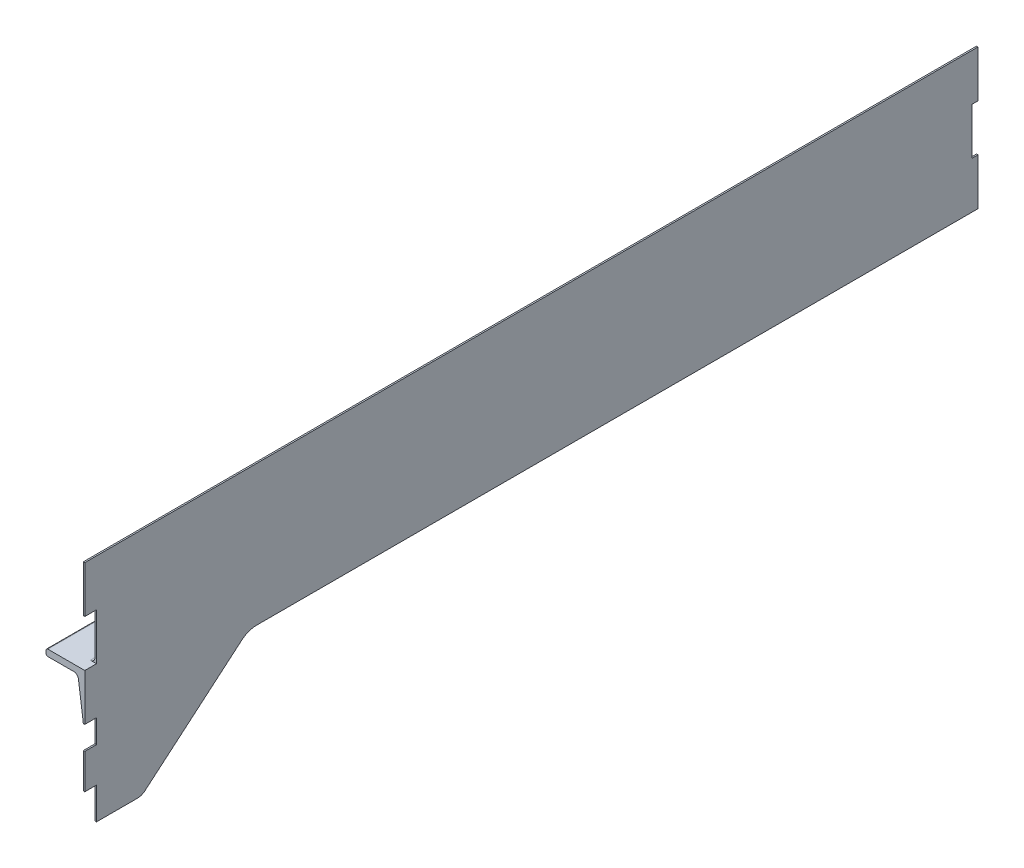
ISO-10303-21;
HEADER;
FILE_DESCRIPTION(('STEP AP214'),'2;1');
FILE_NAME('part.step','',(''),(''),'','','');
FILE_SCHEMA(('AUTOMOTIVE_DESIGN { 1 0 10303 214 1 1 1 1 }'));
ENDSEC;
DATA;
#1=APPLICATION_CONTEXT('core data for automotive mechanical design processes');
#2=APPLICATION_PROTOCOL_DEFINITION('international standard','automotive_design',2000,#1);
#3=PRODUCT_CONTEXT('',#1,'mechanical');
#4=PRODUCT('Part','Part','',(#3));
#5=PRODUCT_RELATED_PRODUCT_CATEGORY('part','',(#4));
#6=PRODUCT_DEFINITION_FORMATION('','',#4);
#7=PRODUCT_DEFINITION_CONTEXT('part definition',#1,'design');
#8=PRODUCT_DEFINITION('design','',#6,#7);
#9=PRODUCT_DEFINITION_SHAPE('','',#8);
#10=(LENGTH_UNIT() NAMED_UNIT(*) SI_UNIT(.MILLI.,.METRE.));
#11=(NAMED_UNIT(*) PLANE_ANGLE_UNIT() SI_UNIT($,.RADIAN.));
#12=(NAMED_UNIT(*) SI_UNIT($,.STERADIAN.) SOLID_ANGLE_UNIT());
#13=UNCERTAINTY_MEASURE_WITH_UNIT(LENGTH_MEASURE(1.E-05),#10,'distance_accuracy_value','');
#14=(GEOMETRIC_REPRESENTATION_CONTEXT(3) GLOBAL_UNCERTAINTY_ASSIGNED_CONTEXT((#13)) GLOBAL_UNIT_ASSIGNED_CONTEXT((#10,
#11,#12)) REPRESENTATION_CONTEXT('',''));
#15=CARTESIAN_POINT('',(0.,0.,0.));
#16=DIRECTION('',(0.,0.,1.));
#17=DIRECTION('',(1.,0.,0.));
#18=AXIS2_PLACEMENT_3D('',#15,#16,#17);
#19=CARTESIAN_POINT('',(-94.488,0.,0.));
#20=DIRECTION('',(-1.,0.,0.));
#21=DIRECTION('',(0.,0.,1.));
#22=AXIS2_PLACEMENT_3D('',#19,#20,#21);
#23=PLANE('',#22);
#24=DIRECTION('',(0.,-1.,0.));
#25=VECTOR('',#24,1.);
#26=CARTESIAN_POINT('',(-94.488,0.,-679.45));
#27=LINE('',#26,#25);
#28=CARTESIAN_POINT('',(-94.488,-85.7250000000001,-679.45));
#29=VERTEX_POINT('',#28);
#30=CARTESIAN_POINT('',(-94.488,-108.585,-679.45));
#31=VERTEX_POINT('',#30);
#32=EDGE_CURVE('E49',#29,#31,#27,.T.);
#33=ORIENTED_EDGE('',*,*,#32,.T.);
#34=DIRECTION('',(0.,0.,-1.));
#35=VECTOR('',#34,1.);
#36=CARTESIAN_POINT('',(-94.488,-108.585,-196.85));
#37=LINE('',#36,#35);
#38=CARTESIAN_POINT('',(-94.488,-108.585,-203.2));
#39=VERTEX_POINT('',#38);
#40=EDGE_CURVE('E11',#31,#39,#37,.F.);
#41=ORIENTED_EDGE('',*,*,#40,.T.);
#42=DIRECTION('',(0.,1.,0.));
#43=VECTOR('',#42,1.);
#44=CARTESIAN_POINT('',(-94.488,0.,-203.2));
#45=LINE('',#44,#43);
#46=CARTESIAN_POINT('',(-94.488,-85.7250000000001,-203.2));
#47=VERTEX_POINT('',#46);
#48=EDGE_CURVE('E226',#39,#47,#45,.T.);
#49=ORIENTED_EDGE('',*,*,#48,.T.);
#50=DIRECTION('',(0.,0.,1.));
#51=VECTOR('',#50,1.);
#52=CARTESIAN_POINT('',(-94.488,-85.7249999999983,7.4940054162198E-13));
#53=LINE('',#52,#51);
#54=CARTESIAN_POINT('',(-94.488,-85.7250000000001,-196.85));
#55=VERTEX_POINT('',#54);
#56=EDGE_CURVE('E228',#47,#55,#53,.T.);
#57=ORIENTED_EDGE('',*,*,#56,.T.);
#58=DIRECTION('',(0.,1.,0.));
#59=VECTOR('',#58,1.);
#60=CARTESIAN_POINT('',(-94.488,8.60422844084493E-13,-196.85));
#61=LINE('',#60,#59);
#62=CARTESIAN_POINT('',(-94.488,-60.325,-196.85));
#63=VERTEX_POINT('',#62);
#64=EDGE_CURVE('E232',#55,#63,#61,.T.);
#65=ORIENTED_EDGE('',*,*,#64,.T.);
#66=DIRECTION('',(0.,0.,-1.));
#67=VECTOR('',#66,1.);
#68=CARTESIAN_POINT('',(-94.488,-60.325,0.));
#69=LINE('',#68,#67);
#70=CARTESIAN_POINT('',(-94.488,-60.3250000000001,-682.625));
#71=VERTEX_POINT('',#70);
#72=EDGE_CURVE('E235',#63,#71,#69,.T.);
#73=ORIENTED_EDGE('',*,*,#72,.T.);
#74=DIRECTION('',(0.,-1.,0.));
#75=VECTOR('',#74,1.);
#76=CARTESIAN_POINT('',(-94.488,0.,-682.625));
#77=LINE('',#76,#75);
#78=CARTESIAN_POINT('',(-94.488,-85.7250000000001,-682.625));
#79=VERTEX_POINT('',#78);
#80=EDGE_CURVE('E238',#71,#79,#77,.T.);
#81=ORIENTED_EDGE('',*,*,#80,.T.);
#82=DIRECTION('',(0.,0.,1.));
#83=VECTOR('',#82,1.);
#84=CARTESIAN_POINT('',(-94.488,-85.7250000000001,0.));
#85=LINE('',#84,#83);
#86=EDGE_CURVE('E241',#79,#29,#85,.T.);
#87=ORIENTED_EDGE('',*,*,#86,.T.);
#88=EDGE_LOOP('',(#33,#41,#49,#57,#65,#73,#81,#87));
#89=FACE_BOUND('',#88,.T.);
#90=ADVANCED_FACE('F35',(#89),#23,.T.);
#91=DIRECTION('',(0.,0.,1.));
#92=VECTOR('',#91,1.);
#93=CARTESIAN_POINT('',(-94.488,-136.525,0.));
#94=LINE('',#93,#92);
#95=CARTESIAN_POINT('',(-94.488,-136.525,-290.406498706893));
#96=VERTEX_POINT('',#95);
#97=CARTESIAN_POINT('',(-94.488,-136.525,-203.2));
#98=VERTEX_POINT('',#97);
#99=EDGE_CURVE('E43',#96,#98,#94,.T.);
#100=ORIENTED_EDGE('',*,*,#99,.F.);
#101=CARTESIAN_POINT('',(-94.488,-149.225,-290.406498706893));
#102=DIRECTION('',(-1.,0.,0.));
#103=DIRECTION('',(0.,0.,1.));
#104=AXIS2_PLACEMENT_3D('',#101,#102,#103);
#105=CIRCLE('',#104,12.7);
#106=CARTESIAN_POINT('',(-94.488,-139.534994681408,-282.197126201904));
#107=VERTEX_POINT('',#106);
#108=EDGE_CURVE('E254',#107,#96,#105,.T.);
#109=ORIENTED_EDGE('',*,*,#108,.F.);
#110=DIRECTION('',(0.,0.646407283857374,-0.762992544771004));
#111=VECTOR('',#110,1.);
#112=CARTESIAN_POINT('',(-94.488,-220.4120949489,-186.73312681973));
#113=LINE('',#112,#111);
#114=CARTESIAN_POINT('',(-94.488,-184.118202659296,-229.572943030403));
#115=VERTEX_POINT('',#114);
#116=EDGE_CURVE('E258',#115,#107,#113,.T.);
#117=ORIENTED_EDGE('',*,*,#116,.F.);
#118=CARTESIAN_POINT('',(-94.488,-179.2732,-225.468256777908));
#119=DIRECTION('',(-1.,0.,0.));
#120=DIRECTION('',(0.,0.,1.));
#121=AXIS2_PLACEMENT_3D('',#118,#119,#120);
#122=CIRCLE('',#121,6.35);
#123=CARTESIAN_POINT('',(-94.488,-185.6232,-225.468256777908));
#124=VERTEX_POINT('',#123);
#125=EDGE_CURVE('E260',#115,#124,#122,.T.);
#126=ORIENTED_EDGE('',*,*,#125,.T.);
#127=DIRECTION('',(0.,0.,-1.));
#128=VECTOR('',#127,1.);
#129=CARTESIAN_POINT('',(-94.488,-185.6232,0.));
#130=LINE('',#129,#128);
#131=CARTESIAN_POINT('',(-94.488,-185.6232,-203.2));
#132=VERTEX_POINT('',#131);
#133=EDGE_CURVE('E263',#132,#124,#130,.T.);
#134=ORIENTED_EDGE('',*,*,#133,.F.);
#135=DIRECTION('',(0.,-1.,0.));
#136=VECTOR('',#135,1.);
#137=CARTESIAN_POINT('',(-94.488,0.,-203.2));
#138=LINE('',#137,#136);
#139=CARTESIAN_POINT('',(-94.488,-168.275,-203.2));
#140=VERTEX_POINT('',#139);
#141=EDGE_CURVE('E266',#140,#132,#138,.T.);
#142=ORIENTED_EDGE('',*,*,#141,.F.);
#143=DIRECTION('',(0.,0.,-1.));
#144=VECTOR('',#143,1.);
#145=CARTESIAN_POINT('',(-94.488,-168.275,0.));
#146=LINE('',#145,#144);
#147=CARTESIAN_POINT('',(-94.488,-168.275,-196.85));
#148=VERTEX_POINT('',#147);
#149=EDGE_CURVE('E268',#148,#140,#146,.T.);
#150=ORIENTED_EDGE('',*,*,#149,.F.);
#151=DIRECTION('',(0.,1.,0.));
#152=VECTOR('',#151,1.);
#153=CARTESIAN_POINT('',(-94.488,0.,-196.85));
#154=LINE('',#153,#152);
#155=CARTESIAN_POINT('',(-94.488,-149.225,-196.85));
#156=VERTEX_POINT('',#155);
#157=EDGE_CURVE('E270',#148,#156,#154,.T.);
#158=ORIENTED_EDGE('',*,*,#157,.T.);
#159=DIRECTION('',(0.,0.,1.));
#160=VECTOR('',#159,1.);
#161=CARTESIAN_POINT('',(-94.488,-149.225,0.));
#162=LINE('',#161,#160);
#163=CARTESIAN_POINT('',(-94.488,-149.225,-203.2));
#164=VERTEX_POINT('',#163);
#165=EDGE_CURVE('E273',#164,#156,#162,.T.);
#166=ORIENTED_EDGE('',*,*,#165,.F.);
#167=DIRECTION('',(0.,-1.,0.));
#168=VECTOR('',#167,1.);
#169=CARTESIAN_POINT('',(-94.488,0.,-203.2));
#170=LINE('',#169,#168);
#171=EDGE_CURVE('E211',#98,#164,#170,.T.);
#172=ORIENTED_EDGE('',*,*,#171,.F.);
#173=EDGE_LOOP('',(#100,#109,#117,#126,#134,#142,#150,#158,#166,#172));
#174=FACE_BOUND('',#173,.T.);
#175=ADVANCED_FACE('F332',(#174),#23,.T.);
#176=CARTESIAN_POINT('',(-93.69425,-8.60422844084499E-13,-196.85));
#177=DIRECTION('',(0.,0.,1.));
#178=DIRECTION('',(0.,-1.,0.));
#179=AXIS2_PLACEMENT_3D('',#176,#177,#178);
#180=PLANE('',#179);
#181=DIRECTION('',(-1.,0.,0.));
#182=VECTOR('',#181,1.);
#183=CARTESIAN_POINT('',(-93.69425,-111.125,-196.85));
#184=LINE('',#183,#182);
#185=CARTESIAN_POINT('',(-93.69425,-111.125,-196.85));
#186=VERTEX_POINT('',#185);
#187=CARTESIAN_POINT('',(-113.793536469165,-111.125,-196.85));
#188=VERTEX_POINT('',#187);
#189=EDGE_CURVE('E135',#186,#188,#184,.T.);
#190=ORIENTED_EDGE('',*,*,#189,.T.);
#191=CARTESIAN_POINT('',(-113.793536469165,-112.125,-196.85));
#192=DIRECTION('',(0.,0.,-1.));
#193=DIRECTION('',(1.,0.,0.));
#194=AXIS2_PLACEMENT_3D('',#191,#192,#193);
#195=CIRCLE('',#194,1.);
#196=CARTESIAN_POINT('',(-114.793536469165,-112.125,-196.85));
#197=VERTEX_POINT('',#196);
#198=EDGE_CURVE('E418',#197,#188,#195,.T.);
#199=ORIENTED_EDGE('',*,*,#198,.F.);
#200=DIRECTION('',(0.,1.,0.));
#201=VECTOR('',#200,1.);
#202=CARTESIAN_POINT('',(-114.793536469165,-112.125,-196.85));
#203=LINE('',#202,#201);
#204=CARTESIAN_POINT('',(-114.793536469165,-113.625,-196.85));
#205=VERTEX_POINT('',#204);
#206=EDGE_CURVE('E463',#205,#197,#203,.T.);
#207=ORIENTED_EDGE('',*,*,#206,.F.);
#208=CARTESIAN_POINT('',(-113.793536469165,-113.625,-196.85));
#209=DIRECTION('',(0.,0.,-1.));
#210=DIRECTION('',(-1.,0.,0.));
#211=AXIS2_PLACEMENT_3D('',#208,#209,#210);
#212=CIRCLE('',#211,1.);
#213=CARTESIAN_POINT('',(-113.793536469165,-114.625,-196.85));
#214=VERTEX_POINT('',#213);
#215=EDGE_CURVE('E466',#214,#205,#212,.T.);
#216=ORIENTED_EDGE('',*,*,#215,.F.);
#217=DIRECTION('',(-1.,0.,0.));
#218=VECTOR('',#217,1.);
#219=CARTESIAN_POINT('',(-99.6829596012726,-114.625,-196.85));
#220=LINE('',#219,#218);
#221=CARTESIAN_POINT('',(-99.6829596012726,-114.625,-196.85));
#222=VERTEX_POINT('',#221);
#223=EDGE_CURVE('E469',#222,#214,#220,.T.);
#224=ORIENTED_EDGE('',*,*,#223,.F.);
#225=CARTESIAN_POINT('',(-99.6829596012726,-117.165,-196.85));
#226=DIRECTION('',(0.,0.,1.));
#227=DIRECTION('',(1.,0.,0.));
#228=AXIS2_PLACEMENT_3D('',#225,#226,#227);
#229=CIRCLE('',#228,2.54000000000001);
#230=CARTESIAN_POINT('',(-97.1661050318732,-116.822884410625,-196.85));
#231=VERTEX_POINT('',#230);
#232=EDGE_CURVE('E472',#231,#222,#229,.T.);
#233=ORIENTED_EDGE('',*,*,#232,.F.);
#234=DIRECTION('',(-0.134691176919452,0.99088762574777,0.));
#235=VECTOR('',#234,1.);
#236=CARTESIAN_POINT('',(-97.1661050318732,-116.822884410625,-196.85));
#237=LINE('',#236,#235);
#238=CARTESIAN_POINT('',(-94.488,-136.525,-196.85));
#239=VERTEX_POINT('',#238);
#240=EDGE_CURVE('E438',#239,#231,#237,.T.);
#241=ORIENTED_EDGE('',*,*,#240,.F.);
#242=DIRECTION('',(-1.,0.,0.));
#243=VECTOR('',#242,1.);
#244=CARTESIAN_POINT('',(-93.69425,-136.525,-196.85));
#245=LINE('',#244,#243);
#246=CARTESIAN_POINT('',(-93.69425,-136.525,-196.85));
#247=VERTEX_POINT('',#246);
#248=EDGE_CURVE('E58',#247,#239,#245,.T.);
#249=ORIENTED_EDGE('',*,*,#248,.F.);
#250=DIRECTION('',(0.,1.,0.));
#251=VECTOR('',#250,1.);
#252=CARTESIAN_POINT('',(-93.69425,-8.60422844084499E-13,-196.85));
#253=LINE('',#252,#251);
#254=EDGE_CURVE('E412',#247,#186,#253,.T.);
#255=ORIENTED_EDGE('',*,*,#254,.T.);
#256=EDGE_LOOP('',(#190,#199,#207,#216,#224,#233,#241,#249,#255));
#257=FACE_BOUND('',#256,.T.);
#258=ADVANCED_FACE('F37',(#257),#180,.T.);
#259=CARTESIAN_POINT('',(-93.69425,-136.525,0.));
#260=DIRECTION('',(0.,-1.,0.));
#261=DIRECTION('',(0.,0.,-1.));
#262=AXIS2_PLACEMENT_3D('',#259,#260,#261);
#263=PLANE('',#262);
#264=DIRECTION('',(0.,0.,1.));
#265=VECTOR('',#264,1.);
#266=CARTESIAN_POINT('',(-94.488,-136.525,0.));
#267=LINE('',#266,#265);
#268=EDGE_CURVE('E255',#98,#239,#267,.T.);
#269=ORIENTED_EDGE('',*,*,#268,.F.);
#270=DIRECTION('',(-1.,0.,0.));
#271=VECTOR('',#270,1.);
#272=CARTESIAN_POINT('',(-93.69425,-136.525,-203.2));
#273=LINE('',#272,#271);
#274=CARTESIAN_POINT('',(-93.69425,-136.525,-203.2));
#275=VERTEX_POINT('',#274);
#276=EDGE_CURVE('E215',#275,#98,#273,.T.);
#277=ORIENTED_EDGE('',*,*,#276,.F.);
#278=DIRECTION('',(0.,0.,1.));
#279=VECTOR('',#278,1.);
#280=CARTESIAN_POINT('',(-93.69425,-136.525,0.));
#281=LINE('',#280,#279);
#282=EDGE_CURVE('E204',#275,#247,#281,.T.);
#283=ORIENTED_EDGE('',*,*,#282,.T.);
#284=ORIENTED_EDGE('',*,*,#248,.T.);
#285=EDGE_LOOP('',(#269,#277,#283,#284));
#286=FACE_BOUND('',#285,.T.);
#287=ADVANCED_FACE('F625',(#286),#263,.T.);
#288=CARTESIAN_POINT('',(-93.69425,0.,-203.2));
#289=DIRECTION('',(0.,0.,-1.));
#290=DIRECTION('',(-1.,0.,0.));
#291=AXIS2_PLACEMENT_3D('',#288,#289,#290);
#292=PLANE('',#291);
#293=ORIENTED_EDGE('',*,*,#171,.T.);
#294=DIRECTION('',(-1.,0.,0.));
#295=VECTOR('',#294,1.);
#296=CARTESIAN_POINT('',(-93.69425,-149.225,-203.2));
#297=LINE('',#296,#295);
#298=CARTESIAN_POINT('',(-93.69425,-149.225,-203.2));
#299=VERTEX_POINT('',#298);
#300=EDGE_CURVE('E208',#299,#164,#297,.T.);
#301=ORIENTED_EDGE('',*,*,#300,.F.);
#302=DIRECTION('',(0.,-1.,0.));
#303=VECTOR('',#302,1.);
#304=CARTESIAN_POINT('',(-93.69425,0.,-203.2));
#305=LINE('',#304,#303);
#306=EDGE_CURVE('E197',#275,#299,#305,.T.);
#307=ORIENTED_EDGE('',*,*,#306,.F.);
#308=ORIENTED_EDGE('',*,*,#276,.T.);
#309=EDGE_LOOP('',(#293,#301,#307,#308));
#310=FACE_BOUND('',#309,.T.);
#311=ADVANCED_FACE('F209',(#310),#292,.F.);
#312=CARTESIAN_POINT('',(-93.69425,-149.225,0.));
#313=DIRECTION('',(0.,-1.,0.));
#314=DIRECTION('',(0.,0.,-1.));
#315=AXIS2_PLACEMENT_3D('',#312,#313,#314);
#316=PLANE('',#315);
#317=ORIENTED_EDGE('',*,*,#165,.T.);
#318=DIRECTION('',(-1.,0.,0.));
#319=VECTOR('',#318,1.);
#320=CARTESIAN_POINT('',(-93.69425,-149.225,-196.85));
#321=LINE('',#320,#319);
#322=CARTESIAN_POINT('',(-93.69425,-149.225,-196.85));
#323=VERTEX_POINT('',#322);
#324=EDGE_CURVE('E216',#323,#156,#321,.T.);
#325=ORIENTED_EDGE('',*,*,#324,.F.);
#326=DIRECTION('',(0.,0.,1.));
#327=VECTOR('',#326,1.);
#328=CARTESIAN_POINT('',(-93.69425,-149.225,0.));
#329=LINE('',#328,#327);
#330=EDGE_CURVE('E202',#299,#323,#329,.T.);
#331=ORIENTED_EDGE('',*,*,#330,.F.);
#332=ORIENTED_EDGE('',*,*,#300,.T.);
#333=EDGE_LOOP('',(#317,#325,#331,#332));
#334=FACE_BOUND('',#333,.T.);
#335=ADVANCED_FACE('F218',(#334),#316,.F.);
#336=CARTESIAN_POINT('',(-93.69425,0.,-196.85));
#337=DIRECTION('',(0.,0.,1.));
#338=DIRECTION('',(1.,0.,0.));
#339=AXIS2_PLACEMENT_3D('',#336,#337,#338);
#340=PLANE('',#339);
#341=ORIENTED_EDGE('',*,*,#157,.F.);
#342=DIRECTION('',(-1.,0.,0.));
#343=VECTOR('',#342,1.);
#344=CARTESIAN_POINT('',(-93.69425,-168.275,-196.85));
#345=LINE('',#344,#343);
#346=CARTESIAN_POINT('',(-93.69425,-168.275,-196.85));
#347=VERTEX_POINT('',#346);
#348=EDGE_CURVE('E280',#347,#148,#345,.T.);
#349=ORIENTED_EDGE('',*,*,#348,.F.);
#350=DIRECTION('',(0.,1.,0.));
#351=VECTOR('',#350,1.);
#352=CARTESIAN_POINT('',(-93.69425,0.,-196.85));
#353=LINE('',#352,#351);
#354=EDGE_CURVE('E220',#347,#323,#353,.T.);
#355=ORIENTED_EDGE('',*,*,#354,.T.);
#356=ORIENTED_EDGE('',*,*,#324,.T.);
#357=EDGE_LOOP('',(#341,#349,#355,#356));
#358=FACE_BOUND('',#357,.T.);
#359=ADVANCED_FACE('F375',(#358),#340,.T.);
#360=CARTESIAN_POINT('',(-93.69425,-168.275,0.));
#361=DIRECTION('',(0.,1.,0.));
#362=DIRECTION('',(0.,0.,1.));
#363=AXIS2_PLACEMENT_3D('',#360,#361,#362);
#364=PLANE('',#363);
#365=ORIENTED_EDGE('',*,*,#149,.T.);
#366=DIRECTION('',(-1.,0.,0.));
#367=VECTOR('',#366,1.);
#368=CARTESIAN_POINT('',(-93.69425,-168.275,-203.2));
#369=LINE('',#368,#367);
#370=CARTESIAN_POINT('',(-93.69425,-168.275,-203.2));
#371=VERTEX_POINT('',#370);
#372=EDGE_CURVE('E282',#371,#140,#369,.T.);
#373=ORIENTED_EDGE('',*,*,#372,.F.);
#374=DIRECTION('',(0.,0.,-1.));
#375=VECTOR('',#374,1.);
#376=CARTESIAN_POINT('',(-93.69425,-168.275,0.));
#377=LINE('',#376,#375);
#378=EDGE_CURVE('E222',#347,#371,#377,.T.);
#379=ORIENTED_EDGE('',*,*,#378,.F.);
#380=ORIENTED_EDGE('',*,*,#348,.T.);
#381=EDGE_LOOP('',(#365,#373,#379,#380));
#382=FACE_BOUND('',#381,.T.);
#383=ADVANCED_FACE('F373',(#382),#364,.F.);
#384=CARTESIAN_POINT('',(-93.69425,0.,-203.2));
#385=DIRECTION('',(0.,0.,-1.));
#386=DIRECTION('',(-1.,0.,0.));
#387=AXIS2_PLACEMENT_3D('',#384,#385,#386);
#388=PLANE('',#387);
#389=ORIENTED_EDGE('',*,*,#141,.T.);
#390=DIRECTION('',(-1.,0.,0.));
#391=VECTOR('',#390,1.);
#392=CARTESIAN_POINT('',(-93.69425,-185.6232,-203.2));
#393=LINE('',#392,#391);
#394=CARTESIAN_POINT('',(-93.69425,-185.6232,-203.2));
#395=VERTEX_POINT('',#394);
#396=EDGE_CURVE('E285',#395,#132,#393,.T.);
#397=ORIENTED_EDGE('',*,*,#396,.F.);
#398=DIRECTION('',(0.,-1.,0.));
#399=VECTOR('',#398,1.);
#400=CARTESIAN_POINT('',(-93.69425,0.,-203.2));
#401=LINE('',#400,#399);
#402=EDGE_CURVE('E370',#371,#395,#401,.T.);
#403=ORIENTED_EDGE('',*,*,#402,.F.);
#404=ORIENTED_EDGE('',*,*,#372,.T.);
#405=EDGE_LOOP('',(#389,#397,#403,#404));
#406=FACE_BOUND('',#405,.T.);
#407=ADVANCED_FACE('F367',(#406),#388,.F.);
#408=CARTESIAN_POINT('',(-93.69425,-185.6232,0.));
#409=DIRECTION('',(0.,1.,0.));
#410=DIRECTION('',(0.,0.,1.));
#411=AXIS2_PLACEMENT_3D('',#408,#409,#410);
#412=PLANE('',#411);
#413=ORIENTED_EDGE('',*,*,#133,.T.);
#414=DIRECTION('',(-1.,0.,0.));
#415=VECTOR('',#414,1.);
#416=CARTESIAN_POINT('',(-93.69425,-185.6232,-225.468256777908));
#417=LINE('',#416,#415);
#418=CARTESIAN_POINT('',(-93.69425,-185.6232,-225.468256777908));
#419=VERTEX_POINT('',#418);
#420=EDGE_CURVE('E288',#419,#124,#417,.T.);
#421=ORIENTED_EDGE('',*,*,#420,.F.);
#422=DIRECTION('',(0.,0.,-1.));
#423=VECTOR('',#422,1.);
#424=CARTESIAN_POINT('',(-93.69425,-185.6232,0.));
#425=LINE('',#424,#423);
#426=EDGE_CURVE('E376',#395,#419,#425,.T.);
#427=ORIENTED_EDGE('',*,*,#426,.F.);
#428=ORIENTED_EDGE('',*,*,#396,.T.);
#429=EDGE_LOOP('',(#413,#421,#427,#428));
#430=FACE_BOUND('',#429,.T.);
#431=ADVANCED_FACE('F361',(#430),#412,.F.);
#432=CARTESIAN_POINT('',(-93.69425,-179.2732,-225.468256777908));
#433=DIRECTION('',(-1.,0.,0.));
#434=DIRECTION('',(0.,0.,1.));
#435=AXIS2_PLACEMENT_3D('',#432,#433,#434);
#436=CYLINDRICAL_SURFACE('',#435,6.35);
#437=ORIENTED_EDGE('',*,*,#125,.F.);
#438=DIRECTION('',(-1.,0.,0.));
#439=VECTOR('',#438,1.);
#440=CARTESIAN_POINT('',(-93.69425,-184.118202659296,-229.572943030403));
#441=LINE('',#440,#439);
#442=CARTESIAN_POINT('',(-93.69425,-184.118202659296,-229.572943030403));
#443=VERTEX_POINT('',#442);
#444=EDGE_CURVE('E290',#443,#115,#441,.T.);
#445=ORIENTED_EDGE('',*,*,#444,.F.);
#446=CARTESIAN_POINT('',(-93.69425,-179.2732,-225.468256777908));
#447=DIRECTION('',(-1.,0.,0.));
#448=DIRECTION('',(0.,0.,1.));
#449=AXIS2_PLACEMENT_3D('',#446,#447,#448);
#450=CIRCLE('',#449,6.35);
#451=EDGE_CURVE('E358',#443,#419,#450,.T.);
#452=ORIENTED_EDGE('',*,*,#451,.T.);
#453=ORIENTED_EDGE('',*,*,#420,.T.);
#454=EDGE_LOOP('',(#437,#445,#452,#453));
#455=FACE_BOUND('',#454,.T.);
#456=ADVANCED_FACE('F355',(#455),#436,.T.);
#457=CARTESIAN_POINT('',(-93.69425,-220.4120949489,-186.73312681973));
#458=DIRECTION('',(0.,0.762992544771004,0.646407283857374));
#459=DIRECTION('',(0.,-0.646407283857374,0.762992544771004));
#460=AXIS2_PLACEMENT_3D('',#457,#458,#459);
#461=PLANE('',#460);
#462=ORIENTED_EDGE('',*,*,#116,.T.);
#463=DIRECTION('',(-1.,0.,0.));
#464=VECTOR('',#463,1.);
#465=CARTESIAN_POINT('',(-93.69425,-139.534994681408,-282.197126201904));
#466=LINE('',#465,#464);
#467=CARTESIAN_POINT('',(-93.69425,-139.534994681408,-282.197126201904));
#468=VERTEX_POINT('',#467);
#469=EDGE_CURVE('E292',#468,#107,#466,.T.);
#470=ORIENTED_EDGE('',*,*,#469,.F.);
#471=DIRECTION('',(0.,0.646407283857374,-0.762992544771004));
#472=VECTOR('',#471,1.);
#473=CARTESIAN_POINT('',(-93.69425,-220.4120949489,-186.73312681973));
#474=LINE('',#473,#472);
#475=EDGE_CURVE('E350',#443,#468,#474,.T.);
#476=ORIENTED_EDGE('',*,*,#475,.F.);
#477=ORIENTED_EDGE('',*,*,#444,.T.);
#478=EDGE_LOOP('',(#462,#470,#476,#477));
#479=FACE_BOUND('',#478,.T.);
#480=ADVANCED_FACE('F349',(#479),#461,.F.);
#481=CARTESIAN_POINT('',(-93.69425,-149.225,-290.406498706893));
#482=DIRECTION('',(-1.,0.,0.));
#483=DIRECTION('',(0.,0.,1.));
#484=AXIS2_PLACEMENT_3D('',#481,#482,#483);
#485=CYLINDRICAL_SURFACE('',#484,12.7);
#486=ORIENTED_EDGE('',*,*,#108,.T.);
#487=DIRECTION('',(-1.,0.,0.));
#488=VECTOR('',#487,1.);
#489=CARTESIAN_POINT('',(-93.69425,-136.525,-290.406498706893));
#490=LINE('',#489,#488);
#491=CARTESIAN_POINT('',(-93.69425,-136.525,-290.406498706893));
#492=VERTEX_POINT('',#491);
#493=EDGE_CURVE('E295',#492,#96,#490,.T.);
#494=ORIENTED_EDGE('',*,*,#493,.F.);
#495=CARTESIAN_POINT('',(-93.69425,-149.225,-290.406498706893));
#496=DIRECTION('',(-1.,0.,0.));
#497=DIRECTION('',(0.,0.,1.));
#498=AXIS2_PLACEMENT_3D('',#495,#496,#497);
#499=CIRCLE('',#498,12.7);
#500=EDGE_CURVE('E346',#468,#492,#499,.T.);
#501=ORIENTED_EDGE('',*,*,#500,.F.);
#502=ORIENTED_EDGE('',*,*,#469,.T.);
#503=EDGE_LOOP('',(#486,#494,#501,#502));
#504=FACE_BOUND('',#503,.T.);
#505=ADVANCED_FACE('F344',(#504),#485,.F.);
#506=CARTESIAN_POINT('',(-94.488,-136.525,-682.625));
#507=VERTEX_POINT('',#506);
#508=CARTESIAN_POINT('',(-94.488,-136.525,-679.45));
#509=VERTEX_POINT('',#508);
#510=EDGE_CURVE('E251',#507,#509,#267,.T.);
#511=ORIENTED_EDGE('',*,*,#510,.F.);
#512=DIRECTION('',(-1.,0.,0.));
#513=VECTOR('',#512,1.);
#514=CARTESIAN_POINT('',(-93.69425,-136.525,-682.625));
#515=LINE('',#514,#513);
#516=CARTESIAN_POINT('',(-93.69425,-136.525,-682.625));
#517=VERTEX_POINT('',#516);
#518=EDGE_CURVE('E298',#517,#507,#515,.T.);
#519=ORIENTED_EDGE('',*,*,#518,.F.);
#520=EDGE_CURVE('E341',#517,#492,#281,.T.);
#521=ORIENTED_EDGE('',*,*,#520,.T.);
#522=ORIENTED_EDGE('',*,*,#493,.T.);
#523=EDGE_CURVE('E250',#509,#96,#267,.T.);
#524=ORIENTED_EDGE('',*,*,#523,.F.);
#525=EDGE_LOOP('',(#511,#519,#521,#522,#524));
#526=FACE_BOUND('',#525,.T.);
#527=ADVANCED_FACE('F338',(#526),#263,.T.);
#528=CARTESIAN_POINT('',(-93.69425,0.,-682.625));
#529=DIRECTION('',(0.,0.,-1.));
#530=DIRECTION('',(-1.,0.,0.));
#531=AXIS2_PLACEMENT_3D('',#528,#529,#530);
#532=PLANE('',#531);
#533=DIRECTION('',(0.,-1.,0.));
#534=VECTOR('',#533,1.);
#535=CARTESIAN_POINT('',(-94.488,0.,-682.625));
#536=LINE('',#535,#534);
#537=CARTESIAN_POINT('',(-94.488,-111.125,-682.625));
#538=VERTEX_POINT('',#537);
#539=EDGE_CURVE('E247',#538,#507,#536,.T.);
#540=ORIENTED_EDGE('',*,*,#539,.F.);
#541=DIRECTION('',(-1.,0.,0.));
#542=VECTOR('',#541,1.);
#543=CARTESIAN_POINT('',(-93.69425,-111.125,-682.625));
#544=LINE('',#543,#542);
#545=CARTESIAN_POINT('',(-93.69425,-111.125,-682.625));
#546=VERTEX_POINT('',#545);
#547=EDGE_CURVE('E300',#546,#538,#544,.T.);
#548=ORIENTED_EDGE('',*,*,#547,.F.);
#549=DIRECTION('',(0.,-1.,0.));
#550=VECTOR('',#549,1.);
#551=CARTESIAN_POINT('',(-93.69425,0.,-682.625));
#552=LINE('',#551,#550);
#553=EDGE_CURVE('E384',#546,#517,#552,.T.);
#554=ORIENTED_EDGE('',*,*,#553,.T.);
#555=ORIENTED_EDGE('',*,*,#518,.T.);
#556=EDGE_LOOP('',(#540,#548,#554,#555));
#557=FACE_BOUND('',#556,.T.);
#558=ADVANCED_FACE('F546',(#557),#532,.T.);
#559=CARTESIAN_POINT('',(-93.69425,-111.125,0.));
#560=DIRECTION('',(0.,1.,0.));
#561=DIRECTION('',(0.,0.,1.));
#562=AXIS2_PLACEMENT_3D('',#559,#560,#561);
#563=PLANE('',#562);
#564=DIRECTION('',(0.,0.,-1.));
#565=VECTOR('',#564,1.);
#566=CARTESIAN_POINT('',(-94.488,-111.125,0.));
#567=LINE('',#566,#565);
#568=CARTESIAN_POINT('',(-94.488,-111.125,-679.45));
#569=VERTEX_POINT('',#568);
#570=EDGE_CURVE('E244',#569,#538,#567,.T.);
#571=ORIENTED_EDGE('',*,*,#570,.F.);
#572=DIRECTION('',(-1.,0.,0.));
#573=VECTOR('',#572,1.);
#574=CARTESIAN_POINT('',(-93.69425,-111.125,-679.45));
#575=LINE('',#574,#573);
#576=CARTESIAN_POINT('',(-93.69425,-111.125,-679.45));
#577=VERTEX_POINT('',#576);
#578=EDGE_CURVE('E302',#577,#569,#575,.T.);
#579=ORIENTED_EDGE('',*,*,#578,.F.);
#580=DIRECTION('',(0.,0.,-1.));
#581=VECTOR('',#580,1.);
#582=CARTESIAN_POINT('',(-93.69425,-111.125,0.));
#583=LINE('',#582,#581);
#584=EDGE_CURVE('E387',#577,#546,#583,.T.);
#585=ORIENTED_EDGE('',*,*,#584,.T.);
#586=ORIENTED_EDGE('',*,*,#547,.T.);
#587=EDGE_LOOP('',(#571,#579,#585,#586));
#588=FACE_BOUND('',#587,.T.);
#589=ADVANCED_FACE('F548',(#588),#563,.T.);
#590=CARTESIAN_POINT('',(-93.69425,0.,-679.45));
#591=DIRECTION('',(0.,0.,-1.));
#592=DIRECTION('',(-1.,0.,0.));
#593=AXIS2_PLACEMENT_3D('',#590,#591,#592);
#594=PLANE('',#593);
#595=ORIENTED_EDGE('',*,*,#32,.F.);
#596=DIRECTION('',(-1.,0.,0.));
#597=VECTOR('',#596,1.);
#598=CARTESIAN_POINT('',(-93.69425,-85.7250000000001,-679.45));
#599=LINE('',#598,#597);
#600=CARTESIAN_POINT('',(-93.69425,-85.7250000000001,-679.45));
#601=VERTEX_POINT('',#600);
#602=EDGE_CURVE('E305',#601,#29,#599,.T.);
#603=ORIENTED_EDGE('',*,*,#602,.F.);
#604=DIRECTION('',(0.,-1.,0.));
#605=VECTOR('',#604,1.);
#606=CARTESIAN_POINT('',(-93.69425,0.,-679.45));
#607=LINE('',#606,#605);
#608=EDGE_CURVE('E390',#601,#577,#607,.T.);
#609=ORIENTED_EDGE('',*,*,#608,.T.);
#610=ORIENTED_EDGE('',*,*,#578,.T.);
#611=DIRECTION('',(0.,-1.,0.));
#612=VECTOR('',#611,1.);
#613=CARTESIAN_POINT('',(-94.488,0.,-679.45));
#614=LINE('',#613,#612);
#615=EDGE_CURVE('E277',#569,#509,#614,.T.);
#616=ORIENTED_EDGE('',*,*,#615,.T.);
#617=DIRECTION('',(-0.134691176919452,0.99088762574777,0.));
#618=VECTOR('',#617,1.);
#619=CARTESIAN_POINT('',(-97.1661050318732,-116.822884410625,-679.45));
#620=LINE('',#619,#618);
#621=CARTESIAN_POINT('',(-97.1661050318732,-116.822884410625,-679.45));
#622=VERTEX_POINT('',#621);
#623=EDGE_CURVE('E457',#509,#622,#620,.T.);
#624=ORIENTED_EDGE('',*,*,#623,.T.);
#625=CARTESIAN_POINT('',(-99.6829596012726,-117.165,-679.45));
#626=DIRECTION('',(0.,0.,1.));
#627=DIRECTION('',(1.,0.,0.));
#628=AXIS2_PLACEMENT_3D('',#625,#626,#627);
#629=CIRCLE('',#628,2.54000000000001);
#630=CARTESIAN_POINT('',(-99.6829596012726,-114.625,-679.45));
#631=VERTEX_POINT('',#630);
#632=EDGE_CURVE('E454',#622,#631,#629,.T.);
#633=ORIENTED_EDGE('',*,*,#632,.T.);
#634=DIRECTION('',(-1.,0.,0.));
#635=VECTOR('',#634,1.);
#636=CARTESIAN_POINT('',(-99.6829596012726,-114.625,-679.45));
#637=LINE('',#636,#635);
#638=CARTESIAN_POINT('',(-113.793536469165,-114.625,-679.45));
#639=VERTEX_POINT('',#638);
#640=EDGE_CURVE('E451',#631,#639,#637,.T.);
#641=ORIENTED_EDGE('',*,*,#640,.T.);
#642=CARTESIAN_POINT('',(-113.793536469165,-113.625,-679.45));
#643=DIRECTION('',(0.,0.,-1.));
#644=DIRECTION('',(-1.,0.,0.));
#645=AXIS2_PLACEMENT_3D('',#642,#643,#644);
#646=CIRCLE('',#645,1.);
#647=CARTESIAN_POINT('',(-114.793536469165,-113.625,-679.45));
#648=VERTEX_POINT('',#647);
#649=EDGE_CURVE('E448',#639,#648,#646,.T.);
#650=ORIENTED_EDGE('',*,*,#649,.T.);
#651=DIRECTION('',(0.,1.,0.));
#652=VECTOR('',#651,1.);
#653=CARTESIAN_POINT('',(-114.793536469165,-112.125,-679.45));
#654=LINE('',#653,#652);
#655=CARTESIAN_POINT('',(-114.793536469165,-112.125,-679.45));
#656=VERTEX_POINT('',#655);
#657=EDGE_CURVE('E445',#648,#656,#654,.T.);
#658=ORIENTED_EDGE('',*,*,#657,.T.);
#659=CARTESIAN_POINT('',(-113.793536469165,-112.125,-679.45));
#660=DIRECTION('',(0.,0.,-1.));
#661=DIRECTION('',(1.,0.,0.));
#662=AXIS2_PLACEMENT_3D('',#659,#660,#661);
#663=CIRCLE('',#662,1.);
#664=CARTESIAN_POINT('',(-113.793536469165,-111.125,-679.45));
#665=VERTEX_POINT('',#664);
#666=EDGE_CURVE('E442',#656,#665,#663,.T.);
#667=ORIENTED_EDGE('',*,*,#666,.T.);
#668=DIRECTION('',(1.,0.,0.));
#669=VECTOR('',#668,1.);
#670=CARTESIAN_POINT('',(-97.028,-111.125,-679.45));
#671=LINE('',#670,#669);
#672=CARTESIAN_POINT('',(-97.028,-111.125,-679.45));
#673=VERTEX_POINT('',#672);
#674=EDGE_CURVE('E439',#665,#673,#671,.T.);
#675=ORIENTED_EDGE('',*,*,#674,.T.);
#676=CARTESIAN_POINT('',(-97.028,-108.585,-679.45));
#677=DIRECTION('',(0.,0.,1.));
#678=DIRECTION('',(-1.,0.,0.));
#679=AXIS2_PLACEMENT_3D('',#676,#677,#678);
#680=CIRCLE('',#679,2.54);
#681=EDGE_CURVE('E435',#673,#31,#680,.T.);
#682=ORIENTED_EDGE('',*,*,#681,.T.);
#683=EDGE_LOOP('',(#595,#603,#609,#610,#616,#624,#633,#641,#650,#658,#667,#675,#682));
#684=FACE_BOUND('',#683,.T.);
#685=ADVANCED_FACE('F494',(#684),#594,.T.);
#686=CARTESIAN_POINT('',(-93.69425,-85.7250000000001,0.));
#687=DIRECTION('',(0.,-1.,0.));
#688=DIRECTION('',(0.,0.,-1.));
#689=AXIS2_PLACEMENT_3D('',#686,#687,#688);
#690=PLANE('',#689);
#691=ORIENTED_EDGE('',*,*,#86,.F.);
#692=DIRECTION('',(-1.,0.,0.));
#693=VECTOR('',#692,1.);
#694=CARTESIAN_POINT('',(-93.69425,-85.7250000000001,-682.625));
#695=LINE('',#694,#693);
#696=CARTESIAN_POINT('',(-93.69425,-85.7250000000001,-682.625));
#697=VERTEX_POINT('',#696);
#698=EDGE_CURVE('E307',#697,#79,#695,.T.);
#699=ORIENTED_EDGE('',*,*,#698,.F.);
#700=DIRECTION('',(0.,0.,1.));
#701=VECTOR('',#700,1.);
#702=CARTESIAN_POINT('',(-93.69425,-85.7250000000001,0.));
#703=LINE('',#702,#701);
#704=EDGE_CURVE('E393',#697,#601,#703,.T.);
#705=ORIENTED_EDGE('',*,*,#704,.T.);
#706=ORIENTED_EDGE('',*,*,#602,.T.);
#707=EDGE_LOOP('',(#691,#699,#705,#706));
#708=FACE_BOUND('',#707,.T.);
#709=ADVANCED_FACE('F553',(#708),#690,.T.);
#710=CARTESIAN_POINT('',(-93.69425,0.,-682.625));
#711=DIRECTION('',(0.,0.,-1.));
#712=DIRECTION('',(-1.,0.,0.));
#713=AXIS2_PLACEMENT_3D('',#710,#711,#712);
#714=PLANE('',#713);
#715=ORIENTED_EDGE('',*,*,#80,.F.);
#716=DIRECTION('',(-1.,0.,0.));
#717=VECTOR('',#716,1.);
#718=CARTESIAN_POINT('',(-93.69425,-60.3250000000001,-682.625));
#719=LINE('',#718,#717);
#720=CARTESIAN_POINT('',(-93.69425,-60.3250000000001,-682.625));
#721=VERTEX_POINT('',#720);
#722=EDGE_CURVE('E309',#721,#71,#719,.T.);
#723=ORIENTED_EDGE('',*,*,#722,.F.);
#724=DIRECTION('',(0.,-1.,0.));
#725=VECTOR('',#724,1.);
#726=CARTESIAN_POINT('',(-93.69425,0.,-682.625));
#727=LINE('',#726,#725);
#728=EDGE_CURVE('E396',#721,#697,#727,.T.);
#729=ORIENTED_EDGE('',*,*,#728,.T.);
#730=ORIENTED_EDGE('',*,*,#698,.T.);
#731=EDGE_LOOP('',(#715,#723,#729,#730));
#732=FACE_BOUND('',#731,.T.);
#733=ADVANCED_FACE('F558',(#732),#714,.T.);
#734=CARTESIAN_POINT('',(-93.69425,-60.325,0.));
#735=DIRECTION('',(0.,1.,0.));
#736=DIRECTION('',(0.,0.,1.));
#737=AXIS2_PLACEMENT_3D('',#734,#735,#736);
#738=PLANE('',#737);
#739=ORIENTED_EDGE('',*,*,#72,.F.);
#740=DIRECTION('',(-1.,0.,0.));
#741=VECTOR('',#740,1.);
#742=CARTESIAN_POINT('',(-93.69425,-60.325,-196.85));
#743=LINE('',#742,#741);
#744=CARTESIAN_POINT('',(-93.69425,-60.325,-196.85));
#745=VERTEX_POINT('',#744);
#746=EDGE_CURVE('E311',#745,#63,#743,.T.);
#747=ORIENTED_EDGE('',*,*,#746,.F.);
#748=DIRECTION('',(0.,0.,-1.));
#749=VECTOR('',#748,1.);
#750=CARTESIAN_POINT('',(-93.69425,-60.325,0.));
#751=LINE('',#750,#749);
#752=EDGE_CURVE('E399',#745,#721,#751,.T.);
#753=ORIENTED_EDGE('',*,*,#752,.T.);
#754=ORIENTED_EDGE('',*,*,#722,.T.);
#755=EDGE_LOOP('',(#739,#747,#753,#754));
#756=FACE_BOUND('',#755,.T.);
#757=ADVANCED_FACE('F561',(#756),#738,.T.);
#758=CARTESIAN_POINT('',(-93.69425,8.60422844084493E-13,-196.85));
#759=DIRECTION('',(0.,0.,1.));
#760=DIRECTION('',(0.,-1.,0.));
#761=AXIS2_PLACEMENT_3D('',#758,#759,#760);
#762=PLANE('',#761);
#763=ORIENTED_EDGE('',*,*,#64,.F.);
#764=DIRECTION('',(-1.,0.,0.));
#765=VECTOR('',#764,1.);
#766=CARTESIAN_POINT('',(-93.69425,-85.7250000000001,-196.85));
#767=LINE('',#766,#765);
#768=CARTESIAN_POINT('',(-93.69425,-85.7250000000001,-196.85));
#769=VERTEX_POINT('',#768);
#770=EDGE_CURVE('E313',#769,#55,#767,.T.);
#771=ORIENTED_EDGE('',*,*,#770,.F.);
#772=DIRECTION('',(0.,1.,0.));
#773=VECTOR('',#772,1.);
#774=CARTESIAN_POINT('',(-93.69425,8.60422844084493E-13,-196.85));
#775=LINE('',#774,#773);
#776=EDGE_CURVE('E402',#769,#745,#775,.T.);
#777=ORIENTED_EDGE('',*,*,#776,.T.);
#778=ORIENTED_EDGE('',*,*,#746,.T.);
#779=EDGE_LOOP('',(#763,#771,#777,#778));
#780=FACE_BOUND('',#779,.T.);
#781=ADVANCED_FACE('F566',(#780),#762,.T.);
#782=CARTESIAN_POINT('',(-93.69425,-85.7249999999983,7.4940054162198E-13));
#783=DIRECTION('',(0.,-1.,0.));
#784=DIRECTION('',(0.,0.,-1.));
#785=AXIS2_PLACEMENT_3D('',#782,#783,#784);
#786=PLANE('',#785);
#787=ORIENTED_EDGE('',*,*,#56,.F.);
#788=DIRECTION('',(-1.,0.,0.));
#789=VECTOR('',#788,1.);
#790=CARTESIAN_POINT('',(-93.69425,-85.7250000000001,-203.2));
#791=LINE('',#790,#789);
#792=CARTESIAN_POINT('',(-93.69425,-85.7250000000001,-203.2));
#793=VERTEX_POINT('',#792);
#794=EDGE_CURVE('E315',#793,#47,#791,.T.);
#795=ORIENTED_EDGE('',*,*,#794,.F.);
#796=DIRECTION('',(0.,0.,1.));
#797=VECTOR('',#796,1.);
#798=CARTESIAN_POINT('',(-93.69425,-85.7249999999983,7.4940054162198E-13));
#799=LINE('',#798,#797);
#800=EDGE_CURVE('E405',#793,#769,#799,.T.);
#801=ORIENTED_EDGE('',*,*,#800,.T.);
#802=ORIENTED_EDGE('',*,*,#770,.T.);
#803=EDGE_LOOP('',(#787,#795,#801,#802));
#804=FACE_BOUND('',#803,.T.);
#805=ADVANCED_FACE('F569',(#804),#786,.T.);
#806=CARTESIAN_POINT('',(-93.69425,0.,-203.2));
#807=DIRECTION('',(0.,0.,1.));
#808=DIRECTION('',(1.,0.,0.));
#809=AXIS2_PLACEMENT_3D('',#806,#807,#808);
#810=PLANE('',#809);
#811=ORIENTED_EDGE('',*,*,#794,.T.);
#812=ORIENTED_EDGE('',*,*,#48,.F.);
#813=CARTESIAN_POINT('',(-97.028,-108.585,-203.2));
#814=DIRECTION('',(0.,0.,-1.));
#815=DIRECTION('',(-1.,0.,0.));
#816=AXIS2_PLACEMENT_3D('',#813,#814,#815);
#817=CIRCLE('',#816,2.54);
#818=CARTESIAN_POINT('',(-97.028,-111.125,-203.2));
#819=VERTEX_POINT('',#818);
#820=EDGE_CURVE('E460',#39,#819,#817,.T.);
#821=ORIENTED_EDGE('',*,*,#820,.T.);
#822=DIRECTION('',(-1.,0.,0.));
#823=VECTOR('',#822,1.);
#824=CARTESIAN_POINT('',(-93.69425,-111.125,-203.2));
#825=LINE('',#824,#823);
#826=CARTESIAN_POINT('',(-93.69425,-111.125,-203.2));
#827=VERTEX_POINT('',#826);
#828=EDGE_CURVE('E318',#827,#819,#825,.T.);
#829=ORIENTED_EDGE('',*,*,#828,.F.);
#830=DIRECTION('',(0.,1.,0.));
#831=VECTOR('',#830,1.);
#832=CARTESIAN_POINT('',(-93.69425,0.,-203.2));
#833=LINE('',#832,#831);
#834=EDGE_CURVE('E408',#827,#793,#833,.T.);
#835=ORIENTED_EDGE('',*,*,#834,.T.);
#836=EDGE_LOOP('',(#811,#812,#821,#829,#835));
#837=FACE_BOUND('',#836,.T.);
#838=ADVANCED_FACE('F482',(#837),#810,.T.);
#839=CARTESIAN_POINT('',(-93.69425,-111.124999999999,4.85722573273509E-13));
#840=DIRECTION('',(0.,1.,0.));
#841=DIRECTION('',(0.,0.,1.));
#842=AXIS2_PLACEMENT_3D('',#839,#840,#841);
#843=PLANE('',#842);
#844=ORIENTED_EDGE('',*,*,#828,.T.);
#845=DIRECTION('',(0.,0.,-1.));
#846=VECTOR('',#845,1.);
#847=CARTESIAN_POINT('',(-97.028,-111.125,-196.85));
#848=LINE('',#847,#846);
#849=EDGE_CURVE('E229',#819,#673,#848,.T.);
#850=ORIENTED_EDGE('',*,*,#849,.T.);
#851=ORIENTED_EDGE('',*,*,#674,.F.);
#852=DIRECTION('',(0.,0.,-1.));
#853=VECTOR('',#852,1.);
#854=CARTESIAN_POINT('',(-113.793536469165,-111.125,-196.85));
#855=LINE('',#854,#853);
#856=EDGE_CURVE('E430',#188,#665,#855,.T.);
#857=ORIENTED_EDGE('',*,*,#856,.F.);
#858=ORIENTED_EDGE('',*,*,#189,.F.);
#859=DIRECTION('',(0.,0.,-1.));
#860=VECTOR('',#859,1.);
#861=CARTESIAN_POINT('',(-93.69425,-111.124999999999,4.85722573273509E-13));
#862=LINE('',#861,#860);
#863=EDGE_CURVE('E410',#186,#827,#862,.T.);
#864=ORIENTED_EDGE('',*,*,#863,.T.);
#865=EDGE_LOOP('',(#844,#850,#851,#857,#858,#864));
#866=FACE_BOUND('',#865,.T.);
#867=ADVANCED_FACE('F490',(#866),#843,.T.);
#868=CARTESIAN_POINT('',(-93.69425,0.,0.));
#869=DIRECTION('',(-1.,0.,0.));
#870=DIRECTION('',(0.,0.,1.));
#871=AXIS2_PLACEMENT_3D('',#868,#869,#870);
#872=PLANE('',#871);
#873=ORIENTED_EDGE('',*,*,#254,.F.);
#874=ORIENTED_EDGE('',*,*,#282,.F.);
#875=ORIENTED_EDGE('',*,*,#306,.T.);
#876=ORIENTED_EDGE('',*,*,#330,.T.);
#877=ORIENTED_EDGE('',*,*,#354,.F.);
#878=ORIENTED_EDGE('',*,*,#378,.T.);
#879=ORIENTED_EDGE('',*,*,#402,.T.);
#880=ORIENTED_EDGE('',*,*,#426,.T.);
#881=ORIENTED_EDGE('',*,*,#451,.F.);
#882=ORIENTED_EDGE('',*,*,#475,.T.);
#883=ORIENTED_EDGE('',*,*,#500,.T.);
#884=ORIENTED_EDGE('',*,*,#520,.F.);
#885=ORIENTED_EDGE('',*,*,#553,.F.);
#886=ORIENTED_EDGE('',*,*,#584,.F.);
#887=ORIENTED_EDGE('',*,*,#608,.F.);
#888=ORIENTED_EDGE('',*,*,#704,.F.);
#889=ORIENTED_EDGE('',*,*,#728,.F.);
#890=ORIENTED_EDGE('',*,*,#752,.F.);
#891=ORIENTED_EDGE('',*,*,#776,.F.);
#892=ORIENTED_EDGE('',*,*,#800,.F.);
#893=ORIENTED_EDGE('',*,*,#834,.F.);
#894=ORIENTED_EDGE('',*,*,#863,.F.);
#895=EDGE_LOOP('',(#873,#874,#875,#876,#877,#878,#879,#880,#881,#882,#883,#884,#885,#886,#887,
#888,#889,#890,#891,#892,#893,#894));
#896=FACE_BOUND('',#895,.T.);
#897=ADVANCED_FACE('F199',(#896),#872,.F.);
#898=ORIENTED_EDGE('',*,*,#615,.F.);
#899=ORIENTED_EDGE('',*,*,#570,.T.);
#900=ORIENTED_EDGE('',*,*,#539,.T.);
#901=ORIENTED_EDGE('',*,*,#510,.T.);
#902=EDGE_LOOP('',(#898,#899,#900,#901));
#903=FACE_BOUND('',#902,.T.);
#904=ADVANCED_FACE('F541',(#903),#23,.T.);
#905=CARTESIAN_POINT('',(-97.028,-108.585,-196.85));
#906=DIRECTION('',(0.,0.,-1.));
#907=DIRECTION('',(-1.,0.,0.));
#908=AXIS2_PLACEMENT_3D('',#905,#906,#907);
#909=CYLINDRICAL_SURFACE('',#908,2.54);
#910=ORIENTED_EDGE('',*,*,#820,.F.);
#911=ORIENTED_EDGE('',*,*,#40,.F.);
#912=ORIENTED_EDGE('',*,*,#681,.F.);
#913=ORIENTED_EDGE('',*,*,#849,.F.);
#914=EDGE_LOOP('',(#910,#911,#912,#913));
#915=FACE_BOUND('',#914,.T.);
#916=ADVANCED_FACE('F488',(#915),#909,.F.);
#917=CARTESIAN_POINT('',(-113.793536469165,-112.125,-196.85));
#918=DIRECTION('',(0.,0.,-1.));
#919=DIRECTION('',(-1.,0.,0.));
#920=AXIS2_PLACEMENT_3D('',#917,#918,#919);
#921=CYLINDRICAL_SURFACE('',#920,1.);
#922=ORIENTED_EDGE('',*,*,#666,.F.);
#923=DIRECTION('',(0.,0.,-1.));
#924=VECTOR('',#923,1.);
#925=CARTESIAN_POINT('',(-114.793536469165,-112.125,-196.85));
#926=LINE('',#925,#924);
#927=EDGE_CURVE('E427',#197,#656,#926,.T.);
#928=ORIENTED_EDGE('',*,*,#927,.F.);
#929=ORIENTED_EDGE('',*,*,#198,.T.);
#930=ORIENTED_EDGE('',*,*,#856,.T.);
#931=EDGE_LOOP('',(#922,#928,#929,#930));
#932=FACE_BOUND('',#931,.T.);
#933=ADVANCED_FACE('F500',(#932),#921,.T.);
#934=CARTESIAN_POINT('',(-114.793536469165,-112.125,-196.85));
#935=DIRECTION('',(-1.,0.,0.));
#936=DIRECTION('',(0.,0.,1.));
#937=AXIS2_PLACEMENT_3D('',#934,#935,#936);
#938=PLANE('',#937);
#939=ORIENTED_EDGE('',*,*,#657,.F.);
#940=DIRECTION('',(0.,0.,-1.));
#941=VECTOR('',#940,1.);
#942=CARTESIAN_POINT('',(-114.793536469165,-113.625,-196.85));
#943=LINE('',#942,#941);
#944=EDGE_CURVE('E424',#205,#648,#943,.T.);
#945=ORIENTED_EDGE('',*,*,#944,.F.);
#946=ORIENTED_EDGE('',*,*,#206,.T.);
#947=ORIENTED_EDGE('',*,*,#927,.T.);
#948=EDGE_LOOP('',(#939,#945,#946,#947));
#949=FACE_BOUND('',#948,.T.);
#950=ADVANCED_FACE('F571',(#949),#938,.T.);
#951=CARTESIAN_POINT('',(-113.793536469165,-113.625,-196.85));
#952=DIRECTION('',(0.,0.,-1.));
#953=DIRECTION('',(-1.,0.,0.));
#954=AXIS2_PLACEMENT_3D('',#951,#952,#953);
#955=CYLINDRICAL_SURFACE('',#954,1.);
#956=ORIENTED_EDGE('',*,*,#649,.F.);
#957=DIRECTION('',(0.,0.,-1.));
#958=VECTOR('',#957,1.);
#959=CARTESIAN_POINT('',(-113.793536469165,-114.625,-196.85));
#960=LINE('',#959,#958);
#961=EDGE_CURVE('E421',#214,#639,#960,.T.);
#962=ORIENTED_EDGE('',*,*,#961,.F.);
#963=ORIENTED_EDGE('',*,*,#215,.T.);
#964=ORIENTED_EDGE('',*,*,#944,.T.);
#965=EDGE_LOOP('',(#956,#962,#963,#964));
#966=FACE_BOUND('',#965,.T.);
#967=ADVANCED_FACE('F573',(#966),#955,.T.);
#968=CARTESIAN_POINT('',(-99.6829596012726,-114.625,-196.85));
#969=DIRECTION('',(0.,-1.,0.));
#970=DIRECTION('',(0.,0.,-1.));
#971=AXIS2_PLACEMENT_3D('',#968,#969,#970);
#972=PLANE('',#971);
#973=ORIENTED_EDGE('',*,*,#640,.F.);
#974=DIRECTION('',(0.,0.,-1.));
#975=VECTOR('',#974,1.);
#976=CARTESIAN_POINT('',(-99.6829596012726,-114.625,-196.85));
#977=LINE('',#976,#975);
#978=EDGE_CURVE('E417',#222,#631,#977,.T.);
#979=ORIENTED_EDGE('',*,*,#978,.F.);
#980=ORIENTED_EDGE('',*,*,#223,.T.);
#981=ORIENTED_EDGE('',*,*,#961,.T.);
#982=EDGE_LOOP('',(#973,#979,#980,#981));
#983=FACE_BOUND('',#982,.T.);
#984=ADVANCED_FACE('F537',(#983),#972,.T.);
#985=CARTESIAN_POINT('',(-99.6829596012726,-117.165,-196.85));
#986=DIRECTION('',(0.,0.,-1.));
#987=DIRECTION('',(-1.,0.,0.));
#988=AXIS2_PLACEMENT_3D('',#985,#986,#987);
#989=CYLINDRICAL_SURFACE('',#988,2.54000000000001);
#990=ORIENTED_EDGE('',*,*,#632,.F.);
#991=DIRECTION('',(0.,0.,-1.));
#992=VECTOR('',#991,1.);
#993=CARTESIAN_POINT('',(-97.1661050318732,-116.822884410625,-196.85));
#994=LINE('',#993,#992);
#995=EDGE_CURVE('E414',#231,#622,#994,.T.);
#996=ORIENTED_EDGE('',*,*,#995,.F.);
#997=ORIENTED_EDGE('',*,*,#232,.T.);
#998=ORIENTED_EDGE('',*,*,#978,.T.);
#999=EDGE_LOOP('',(#990,#996,#997,#998));
#1000=FACE_BOUND('',#999,.T.);
#1001=ADVANCED_FACE('F531',(#1000),#989,.F.);
#1002=CARTESIAN_POINT('',(-97.1661050318732,-116.822884410625,-196.85));
#1003=DIRECTION('',(-0.99088762574777,-0.134691176919452,0.));
#1004=DIRECTION('',(0.134691176919452,-0.99088762574777,0.));
#1005=AXIS2_PLACEMENT_3D('',#1002,#1003,#1004);
#1006=PLANE('',#1005);
#1007=ORIENTED_EDGE('',*,*,#623,.F.);
#1008=ORIENTED_EDGE('',*,*,#523,.T.);
#1009=ORIENTED_EDGE('',*,*,#99,.T.);
#1010=ORIENTED_EDGE('',*,*,#268,.T.);
#1011=ORIENTED_EDGE('',*,*,#240,.T.);
#1012=ORIENTED_EDGE('',*,*,#995,.T.);
#1013=EDGE_LOOP('',(#1007,#1008,#1009,#1010,#1011,#1012));
#1014=FACE_BOUND('',#1013,.T.);
#1015=ADVANCED_FACE('F327',(#1014),#1006,.T.);
#1016=CLOSED_SHELL('',(#90,#175,#258,#287,#311,#335,#359,#383,#407,#431,#456,#480,#505,#527,
#558,#589,#685,#709,#733,#757,#781,#805,#838,#867,#897,#904,#916,#933,#950,#967,#984,#1001,#1015));
#1017=MANIFOLD_SOLID_BREP('B2',#1016);
#1018=ADVANCED_BREP_SHAPE_REPRESENTATION('',(#18,#1017),#14);
#1019=SHAPE_DEFINITION_REPRESENTATION(#9,#1018);
ENDSEC;
END-ISO-10303-21;
